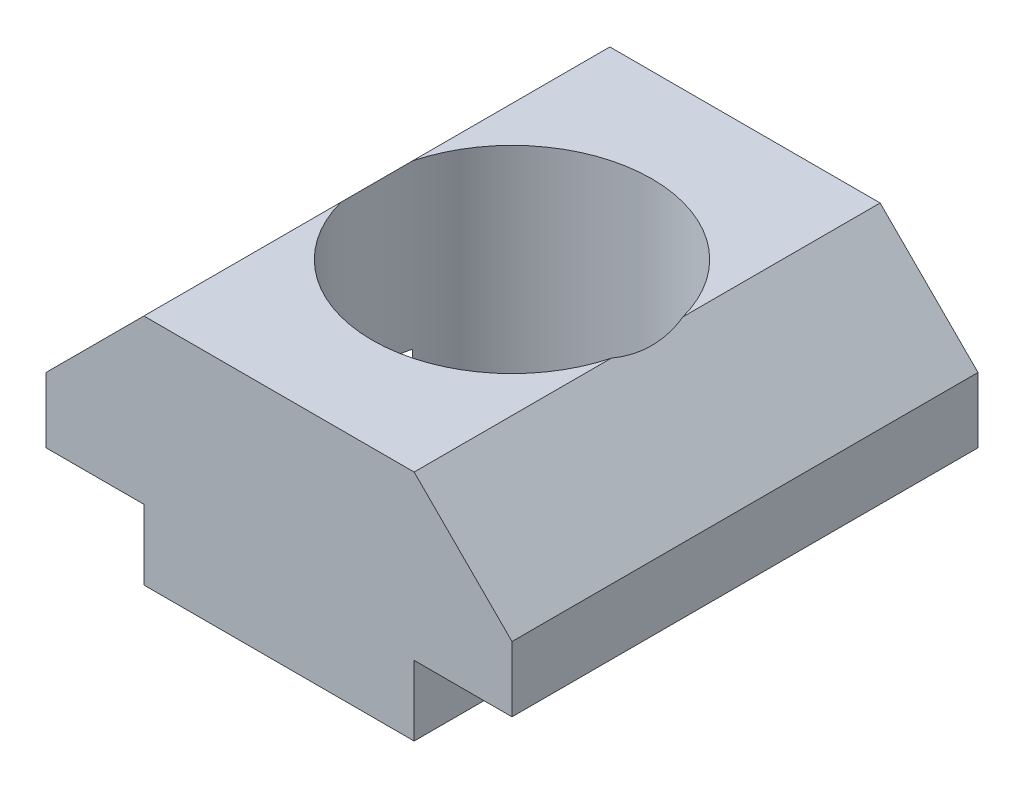
ISO-10303-21;
HEADER;
FILE_DESCRIPTION(('STEP AP214'),'2;1');
FILE_NAME('part.step','',(''),(''),'','','');
FILE_SCHEMA(('AUTOMOTIVE_DESIGN { 1 0 10303 214 1 1 1 1 }'));
ENDSEC;
DATA;
#1=APPLICATION_CONTEXT('core data for automotive mechanical design processes');
#2=APPLICATION_PROTOCOL_DEFINITION('international standard','automotive_design',2000,#1);
#3=PRODUCT_CONTEXT('',#1,'mechanical');
#4=PRODUCT('Part','Part','',(#3));
#5=PRODUCT_RELATED_PRODUCT_CATEGORY('part','',(#4));
#6=PRODUCT_DEFINITION_FORMATION('','',#4);
#7=PRODUCT_DEFINITION_CONTEXT('part definition',#1,'design');
#8=PRODUCT_DEFINITION('design','',#6,#7);
#9=PRODUCT_DEFINITION_SHAPE('','',#8);
#10=(LENGTH_UNIT() NAMED_UNIT(*) SI_UNIT(.MILLI.,.METRE.));
#11=(NAMED_UNIT(*) PLANE_ANGLE_UNIT() SI_UNIT($,.RADIAN.));
#12=(NAMED_UNIT(*) SI_UNIT($,.STERADIAN.) SOLID_ANGLE_UNIT());
#13=UNCERTAINTY_MEASURE_WITH_UNIT(LENGTH_MEASURE(1.E-05),#10,'distance_accuracy_value','');
#14=(GEOMETRIC_REPRESENTATION_CONTEXT(3) GLOBAL_UNCERTAINTY_ASSIGNED_CONTEXT((#13)) GLOBAL_UNIT_ASSIGNED_CONTEXT((#10,
#11,#12)) REPRESENTATION_CONTEXT('',''));
#15=CARTESIAN_POINT('',(0.,0.,0.));
#16=DIRECTION('',(0.,0.,1.));
#17=DIRECTION('',(1.,0.,0.));
#18=AXIS2_PLACEMENT_3D('',#15,#16,#17);
#19=CARTESIAN_POINT('',(-2.9,1.5,-10.));
#20=DIRECTION('',(-1.,0.,0.));
#21=DIRECTION('',(0.,-1.,0.));
#22=AXIS2_PLACEMENT_3D('',#19,#20,#21);
#23=PLANE('',#22);
#24=DIRECTION('',(0.,1.,0.));
#25=VECTOR('',#24,1.);
#26=CARTESIAN_POINT('',(-2.9,0.,-4.2318854252109));
#27=LINE('',#26,#25);
#28=CARTESIAN_POINT('',(-2.9,0.,-4.2318854252109));
#29=VERTEX_POINT('',#28);
#30=CARTESIAN_POINT('',(-2.9,1.5,-4.2318854252109));
#31=VERTEX_POINT('',#30);
#32=EDGE_CURVE('E224',#29,#31,#27,.T.);
#33=ORIENTED_EDGE('',*,*,#32,.F.);
#34=DIRECTION('',(0.,0.,1.));
#35=VECTOR('',#34,1.);
#36=CARTESIAN_POINT('',(-2.9,0.,-10.));
#37=LINE('',#36,#35);
#38=CARTESIAN_POINT('',(-2.9,0.,0.));
#39=VERTEX_POINT('',#38);
#40=EDGE_CURVE('E161',#29,#39,#37,.T.);
#41=ORIENTED_EDGE('',*,*,#40,.T.);
#42=DIRECTION('',(0.,-1.,0.));
#43=VECTOR('',#42,1.);
#44=CARTESIAN_POINT('',(-2.9,1.5,0.));
#45=LINE('',#44,#43);
#46=CARTESIAN_POINT('',(-2.9,1.5,0.));
#47=VERTEX_POINT('',#46);
#48=EDGE_CURVE('E221',#47,#39,#45,.T.);
#49=ORIENTED_EDGE('',*,*,#48,.F.);
#50=DIRECTION('',(0.,0.,1.));
#51=VECTOR('',#50,1.);
#52=CARTESIAN_POINT('',(-2.9,1.5,-10.));
#53=LINE('',#52,#51);
#54=EDGE_CURVE('E192',#31,#47,#53,.T.);
#55=ORIENTED_EDGE('',*,*,#54,.F.);
#56=EDGE_LOOP('',(#33,#41,#49,#55));
#57=FACE_BOUND('',#56,.T.);
#58=ADVANCED_FACE('F34',(#57),#23,.T.);
#59=CARTESIAN_POINT('',(2.9,5.,-10.));
#60=DIRECTION('',(0.,1.,0.));
#61=DIRECTION('',(0.,0.,1.));
#62=AXIS2_PLACEMENT_3D('',#59,#60,#61);
#63=PLANE('',#62);
#64=CARTESIAN_POINT('',(0.,5.,-4.99999999999773));
#65=DIRECTION('',(0.,1.,0.));
#66=DIRECTION('',(0.,0.,1.));
#67=AXIS2_PLACEMENT_3D('',#64,#65,#66);
#68=CIRCLE('',#67,3.);
#69=CARTESIAN_POINT('',(2.9,5.,-5.76811457478462));
#70=VERTEX_POINT('',#69);
#71=CARTESIAN_POINT('',(-2.9,5.,-5.76811457478455));
#72=VERTEX_POINT('',#71);
#73=EDGE_CURVE('E153',#70,#72,#68,.T.);
#74=ORIENTED_EDGE('',*,*,#73,.F.);
#75=DIRECTION('',(0.,0.,1.));
#76=VECTOR('',#75,1.);
#77=CARTESIAN_POINT('',(2.9,5.,-10.));
#78=LINE('',#77,#76);
#79=CARTESIAN_POINT('',(2.9,5.,-10.));
#80=VERTEX_POINT('',#79);
#81=EDGE_CURVE('E181',#80,#70,#78,.T.);
#82=ORIENTED_EDGE('',*,*,#81,.F.);
#83=DIRECTION('',(-1.,0.,0.));
#84=VECTOR('',#83,1.);
#85=CARTESIAN_POINT('',(2.9,5.,-10.));
#86=LINE('',#85,#84);
#87=CARTESIAN_POINT('',(-2.9,5.,-10.));
#88=VERTEX_POINT('',#87);
#89=EDGE_CURVE('E234',#80,#88,#86,.T.);
#90=ORIENTED_EDGE('',*,*,#89,.T.);
#91=DIRECTION('',(0.,0.,1.));
#92=VECTOR('',#91,1.);
#93=CARTESIAN_POINT('',(-2.9,5.,-10.));
#94=LINE('',#93,#92);
#95=EDGE_CURVE('E185',#88,#72,#94,.T.);
#96=ORIENTED_EDGE('',*,*,#95,.T.);
#97=EDGE_LOOP('',(#74,#82,#90,#96));
#98=FACE_BOUND('',#97,.T.);
#99=ADVANCED_FACE('F273',(#98),#63,.T.);
#100=CARTESIAN_POINT('',(2.9,0.,-10.));
#101=DIRECTION('',(1.,0.,0.));
#102=DIRECTION('',(0.,0.,-1.));
#103=AXIS2_PLACEMENT_3D('',#100,#101,#102);
#104=PLANE('',#103);
#105=DIRECTION('',(0.,1.,0.));
#106=VECTOR('',#105,1.);
#107=CARTESIAN_POINT('',(2.9,0.,-5.76811457478462));
#108=LINE('',#107,#106);
#109=CARTESIAN_POINT('',(2.9,0.,-5.76811457478462));
#110=VERTEX_POINT('',#109);
#111=CARTESIAN_POINT('',(2.9,1.5,-5.76811457478462));
#112=VERTEX_POINT('',#111);
#113=EDGE_CURVE('E262',#110,#112,#108,.T.);
#114=ORIENTED_EDGE('',*,*,#113,.F.);
#115=DIRECTION('',(0.,0.,1.));
#116=VECTOR('',#115,1.);
#117=CARTESIAN_POINT('',(2.9,0.,-10.));
#118=LINE('',#117,#116);
#119=CARTESIAN_POINT('',(2.9,0.,-10.));
#120=VERTEX_POINT('',#119);
#121=EDGE_CURVE('E166',#120,#110,#118,.T.);
#122=ORIENTED_EDGE('',*,*,#121,.F.);
#123=DIRECTION('',(0.,1.,0.));
#124=VECTOR('',#123,1.);
#125=CARTESIAN_POINT('',(2.9,0.,-10.));
#126=LINE('',#125,#124);
#127=CARTESIAN_POINT('',(2.9,1.5,-10.));
#128=VERTEX_POINT('',#127);
#129=EDGE_CURVE('E246',#120,#128,#126,.T.);
#130=ORIENTED_EDGE('',*,*,#129,.T.);
#131=DIRECTION('',(0.,0.,1.));
#132=VECTOR('',#131,1.);
#133=CARTESIAN_POINT('',(2.9,1.5,-10.));
#134=LINE('',#133,#132);
#135=EDGE_CURVE('E173',#128,#112,#134,.T.);
#136=ORIENTED_EDGE('',*,*,#135,.T.);
#137=EDGE_LOOP('',(#114,#122,#130,#136));
#138=FACE_BOUND('',#137,.T.);
#139=ADVANCED_FACE('F294',(#138),#104,.T.);
#140=CARTESIAN_POINT('',(-2.9,0.,-10.));
#141=DIRECTION('',(0.,-1.,0.));
#142=DIRECTION('',(0.,0.,-1.));
#143=AXIS2_PLACEMENT_3D('',#140,#141,#142);
#144=PLANE('',#143);
#145=CARTESIAN_POINT('',(0.,0.,-4.99999999999773));
#146=DIRECTION('',(0.,-1.,0.));
#147=DIRECTION('',(0.,0.,-1.));
#148=AXIS2_PLACEMENT_3D('',#145,#146,#147);
#149=CIRCLE('',#148,3.);
#150=CARTESIAN_POINT('',(2.9,0.,-4.23188542521083));
#151=VERTEX_POINT('',#150);
#152=EDGE_CURVE('E11',#151,#29,#149,.T.);
#153=ORIENTED_EDGE('',*,*,#152,.F.);
#154=CARTESIAN_POINT('',(2.9,0.,0.));
#155=VERTEX_POINT('',#154);
#156=EDGE_CURVE('E159',#151,#155,#118,.T.);
#157=ORIENTED_EDGE('',*,*,#156,.T.);
#158=DIRECTION('',(1.,0.,0.));
#159=VECTOR('',#158,1.);
#160=CARTESIAN_POINT('',(-2.9,0.,0.));
#161=LINE('',#160,#159);
#162=EDGE_CURVE('E219',#39,#155,#161,.T.);
#163=ORIENTED_EDGE('',*,*,#162,.F.);
#164=ORIENTED_EDGE('',*,*,#40,.F.);
#165=EDGE_LOOP('',(#153,#157,#163,#164));
#166=FACE_BOUND('',#165,.T.);
#167=ADVANCED_FACE('F157',(#166),#144,.T.);
#168=DIRECTION('',(0.,1.,0.));
#169=VECTOR('',#168,1.);
#170=CARTESIAN_POINT('',(-2.9,0.,-5.76811457478455));
#171=LINE('',#170,#169);
#172=CARTESIAN_POINT('',(-2.9,1.5,-5.76811457478456));
#173=VERTEX_POINT('',#172);
#174=CARTESIAN_POINT('',(-2.9,0.,-5.76811457478455));
#175=VERTEX_POINT('',#174);
#176=EDGE_CURVE('E57',#173,#175,#171,.F.);
#177=ORIENTED_EDGE('',*,*,#176,.F.);
#178=CARTESIAN_POINT('',(-2.9,1.5,-10.));
#179=VERTEX_POINT('',#178);
#180=EDGE_CURVE('E193',#179,#173,#53,.T.);
#181=ORIENTED_EDGE('',*,*,#180,.F.);
#182=DIRECTION('',(0.,-1.,0.));
#183=VECTOR('',#182,1.);
#184=CARTESIAN_POINT('',(-2.9,1.5,-10.));
#185=LINE('',#184,#183);
#186=CARTESIAN_POINT('',(-2.9,0.,-10.));
#187=VERTEX_POINT('',#186);
#188=EDGE_CURVE('E199',#179,#187,#185,.T.);
#189=ORIENTED_EDGE('',*,*,#188,.T.);
#190=EDGE_CURVE('E167',#187,#175,#37,.T.);
#191=ORIENTED_EDGE('',*,*,#190,.T.);
#192=EDGE_LOOP('',(#177,#181,#189,#191));
#193=FACE_BOUND('',#192,.T.);
#194=ADVANCED_FACE('F36',(#193),#23,.T.);
#195=CARTESIAN_POINT('',(-5.,1.5,-10.));
#196=DIRECTION('',(0.,-1.,0.));
#197=DIRECTION('',(0.,0.,-1.));
#198=AXIS2_PLACEMENT_3D('',#195,#196,#197);
#199=PLANE('',#198);
#200=CARTESIAN_POINT('',(0.,1.5,-4.99999999999773));
#201=DIRECTION('',(0.,-1.,0.));
#202=DIRECTION('',(0.,0.,-1.));
#203=AXIS2_PLACEMENT_3D('',#200,#201,#202);
#204=CIRCLE('',#203,3.);
#205=EDGE_CURVE('E256',#31,#173,#204,.T.);
#206=ORIENTED_EDGE('',*,*,#205,.F.);
#207=ORIENTED_EDGE('',*,*,#54,.T.);
#208=DIRECTION('',(1.,0.,0.));
#209=VECTOR('',#208,1.);
#210=CARTESIAN_POINT('',(-5.,1.5,0.));
#211=LINE('',#210,#209);
#212=CARTESIAN_POINT('',(-5.,1.5,0.));
#213=VERTEX_POINT('',#212);
#214=EDGE_CURVE('E196',#213,#47,#211,.T.);
#215=ORIENTED_EDGE('',*,*,#214,.F.);
#216=DIRECTION('',(0.,0.,1.));
#217=VECTOR('',#216,1.);
#218=CARTESIAN_POINT('',(-5.,1.5,-10.));
#219=LINE('',#218,#217);
#220=CARTESIAN_POINT('',(-5.,1.5,-10.));
#221=VERTEX_POINT('',#220);
#222=EDGE_CURVE('E190',#221,#213,#219,.T.);
#223=ORIENTED_EDGE('',*,*,#222,.F.);
#224=DIRECTION('',(1.,0.,0.));
#225=VECTOR('',#224,1.);
#226=CARTESIAN_POINT('',(-5.,1.5,-10.));
#227=LINE('',#226,#225);
#228=EDGE_CURVE('E225',#221,#179,#227,.T.);
#229=ORIENTED_EDGE('',*,*,#228,.T.);
#230=ORIENTED_EDGE('',*,*,#180,.T.);
#231=EDGE_LOOP('',(#206,#207,#215,#223,#229,#230));
#232=FACE_BOUND('',#231,.T.);
#233=ADVANCED_FACE('F302',(#232),#199,.T.);
#234=CARTESIAN_POINT('',(-5.,2.89999999999999,-10.));
#235=DIRECTION('',(-1.,0.,0.));
#236=DIRECTION('',(0.,-1.,0.));
#237=AXIS2_PLACEMENT_3D('',#234,#235,#236);
#238=PLANE('',#237);
#239=DIRECTION('',(0.,-1.,0.));
#240=VECTOR('',#239,1.);
#241=CARTESIAN_POINT('',(-5.,2.89999999999999,0.));
#242=LINE('',#241,#240);
#243=CARTESIAN_POINT('',(-5.,2.89999999999999,0.));
#244=VERTEX_POINT('',#243);
#245=EDGE_CURVE('E200',#244,#213,#242,.T.);
#246=ORIENTED_EDGE('',*,*,#245,.F.);
#247=DIRECTION('',(0.,0.,1.));
#248=VECTOR('',#247,1.);
#249=CARTESIAN_POINT('',(-5.,2.89999999999999,-10.));
#250=LINE('',#249,#248);
#251=CARTESIAN_POINT('',(-5.,2.89999999999999,-10.));
#252=VERTEX_POINT('',#251);
#253=EDGE_CURVE('E188',#252,#244,#250,.T.);
#254=ORIENTED_EDGE('',*,*,#253,.F.);
#255=DIRECTION('',(0.,-1.,0.));
#256=VECTOR('',#255,1.);
#257=CARTESIAN_POINT('',(-5.,2.89999999999999,-10.));
#258=LINE('',#257,#256);
#259=EDGE_CURVE('E228',#252,#221,#258,.T.);
#260=ORIENTED_EDGE('',*,*,#259,.T.);
#261=ORIENTED_EDGE('',*,*,#222,.T.);
#262=EDGE_LOOP('',(#246,#254,#260,#261));
#263=FACE_BOUND('',#262,.T.);
#264=ADVANCED_FACE('F306',(#263),#238,.T.);
#265=CARTESIAN_POINT('',(-2.9,5.,-10.));
#266=DIRECTION('',(-0.707106781186549,0.707106781186546,0.));
#267=DIRECTION('',(-0.707106781186546,-0.707106781186549,0.));
#268=AXIS2_PLACEMENT_3D('',#265,#266,#267);
#269=PLANE('',#268);
#270=CARTESIAN_POINT('',(0.,7.90000000000002,-4.99999999999773));
#271=DIRECTION('',(-0.707106781186549,0.707106781186546,0.));
#272=DIRECTION('',(0.707106781186546,0.707106781186549,0.));
#273=AXIS2_PLACEMENT_3D('',#270,#271,#272);
#274=ELLIPSE('',#273,4.2426406871193,3.);
#275=CARTESIAN_POINT('',(-2.9,5.,-4.2318854252109));
#276=VERTEX_POINT('',#275);
#277=EDGE_CURVE('E258',#72,#276,#274,.T.);
#278=ORIENTED_EDGE('',*,*,#277,.F.);
#279=ORIENTED_EDGE('',*,*,#95,.F.);
#280=DIRECTION('',(-0.707106781186546,-0.707106781186549,0.));
#281=VECTOR('',#280,1.);
#282=CARTESIAN_POINT('',(-2.9,5.,-10.));
#283=LINE('',#282,#281);
#284=EDGE_CURVE('E231',#88,#252,#283,.T.);
#285=ORIENTED_EDGE('',*,*,#284,.T.);
#286=ORIENTED_EDGE('',*,*,#253,.T.);
#287=DIRECTION('',(-0.707106781186546,-0.707106781186549,0.));
#288=VECTOR('',#287,1.);
#289=CARTESIAN_POINT('',(-2.9,5.,0.));
#290=LINE('',#289,#288);
#291=CARTESIAN_POINT('',(-2.9,5.,0.));
#292=VERTEX_POINT('',#291);
#293=EDGE_CURVE('E203',#292,#244,#290,.T.);
#294=ORIENTED_EDGE('',*,*,#293,.F.);
#295=EDGE_CURVE('E184',#276,#292,#94,.T.);
#296=ORIENTED_EDGE('',*,*,#295,.F.);
#297=EDGE_LOOP('',(#278,#279,#285,#286,#294,#296));
#298=FACE_BOUND('',#297,.T.);
#299=ADVANCED_FACE('F270',(#298),#269,.T.);
#300=CARTESIAN_POINT('',(2.9,5.,-4.23188542521084));
#301=VERTEX_POINT('',#300);
#302=EDGE_CURVE('E49',#276,#301,#68,.T.);
#303=ORIENTED_EDGE('',*,*,#302,.F.);
#304=ORIENTED_EDGE('',*,*,#295,.T.);
#305=DIRECTION('',(-1.,0.,0.));
#306=VECTOR('',#305,1.);
#307=CARTESIAN_POINT('',(2.9,5.,0.));
#308=LINE('',#307,#306);
#309=CARTESIAN_POINT('',(2.9,5.,0.));
#310=VERTEX_POINT('',#309);
#311=EDGE_CURVE('E206',#310,#292,#308,.T.);
#312=ORIENTED_EDGE('',*,*,#311,.F.);
#313=EDGE_CURVE('E180',#301,#310,#78,.T.);
#314=ORIENTED_EDGE('',*,*,#313,.F.);
#315=EDGE_LOOP('',(#303,#304,#312,#314));
#316=FACE_BOUND('',#315,.T.);
#317=ADVANCED_FACE('F312',(#316),#63,.T.);
#318=CARTESIAN_POINT('',(5.,2.89999999999999,-10.));
#319=DIRECTION('',(0.707106781186549,0.707106781186546,0.));
#320=DIRECTION('',(-0.707106781186546,0.707106781186549,0.));
#321=AXIS2_PLACEMENT_3D('',#318,#319,#320);
#322=PLANE('',#321);
#323=CARTESIAN_POINT('',(0.,7.90000000000001,-4.99999999999773));
#324=DIRECTION('',(0.707106781186549,0.707106781186546,0.));
#325=DIRECTION('',(-0.707106781186546,0.707106781186549,0.));
#326=AXIS2_PLACEMENT_3D('',#323,#324,#325);
#327=ELLIPSE('',#326,4.2426406871193,3.);
#328=EDGE_CURVE('E260',#301,#70,#327,.T.);
#329=ORIENTED_EDGE('',*,*,#328,.F.);
#330=ORIENTED_EDGE('',*,*,#313,.T.);
#331=DIRECTION('',(-0.707106781186546,0.707106781186549,0.));
#332=VECTOR('',#331,1.);
#333=CARTESIAN_POINT('',(5.,2.89999999999999,0.));
#334=LINE('',#333,#332);
#335=CARTESIAN_POINT('',(5.,2.89999999999999,0.));
#336=VERTEX_POINT('',#335);
#337=EDGE_CURVE('E209',#336,#310,#334,.T.);
#338=ORIENTED_EDGE('',*,*,#337,.F.);
#339=DIRECTION('',(0.,0.,1.));
#340=VECTOR('',#339,1.);
#341=CARTESIAN_POINT('',(5.,2.89999999999999,-10.));
#342=LINE('',#341,#340);
#343=CARTESIAN_POINT('',(5.,2.89999999999999,-10.));
#344=VERTEX_POINT('',#343);
#345=EDGE_CURVE('E178',#344,#336,#342,.T.);
#346=ORIENTED_EDGE('',*,*,#345,.F.);
#347=DIRECTION('',(-0.707106781186546,0.707106781186549,0.));
#348=VECTOR('',#347,1.);
#349=CARTESIAN_POINT('',(5.,2.89999999999999,-10.));
#350=LINE('',#349,#348);
#351=EDGE_CURVE('E237',#344,#80,#350,.T.);
#352=ORIENTED_EDGE('',*,*,#351,.T.);
#353=ORIENTED_EDGE('',*,*,#81,.T.);
#354=EDGE_LOOP('',(#329,#330,#338,#346,#352,#353));
#355=FACE_BOUND('',#354,.T.);
#356=ADVANCED_FACE('F282',(#355),#322,.T.);
#357=CARTESIAN_POINT('',(5.,1.5,-10.));
#358=DIRECTION('',(1.,0.,0.));
#359=DIRECTION('',(0.,0.,-1.));
#360=AXIS2_PLACEMENT_3D('',#357,#358,#359);
#361=PLANE('',#360);
#362=DIRECTION('',(0.,1.,0.));
#363=VECTOR('',#362,1.);
#364=CARTESIAN_POINT('',(5.,1.5,0.));
#365=LINE('',#364,#363);
#366=CARTESIAN_POINT('',(5.,1.5,0.));
#367=VERTEX_POINT('',#366);
#368=EDGE_CURVE('E212',#367,#336,#365,.T.);
#369=ORIENTED_EDGE('',*,*,#368,.F.);
#370=DIRECTION('',(0.,0.,1.));
#371=VECTOR('',#370,1.);
#372=CARTESIAN_POINT('',(5.,1.5,-10.));
#373=LINE('',#372,#371);
#374=CARTESIAN_POINT('',(5.,1.5,-10.));
#375=VERTEX_POINT('',#374);
#376=EDGE_CURVE('E176',#375,#367,#373,.T.);
#377=ORIENTED_EDGE('',*,*,#376,.F.);
#378=DIRECTION('',(0.,1.,0.));
#379=VECTOR('',#378,1.);
#380=CARTESIAN_POINT('',(5.,1.5,-10.));
#381=LINE('',#380,#379);
#382=EDGE_CURVE('E240',#375,#344,#381,.T.);
#383=ORIENTED_EDGE('',*,*,#382,.T.);
#384=ORIENTED_EDGE('',*,*,#345,.T.);
#385=EDGE_LOOP('',(#369,#377,#383,#384));
#386=FACE_BOUND('',#385,.T.);
#387=ADVANCED_FACE('F286',(#386),#361,.T.);
#388=CARTESIAN_POINT('',(2.9,1.5,-10.));
#389=DIRECTION('',(0.,-1.,0.));
#390=DIRECTION('',(1.,0.,0.));
#391=AXIS2_PLACEMENT_3D('',#388,#389,#390);
#392=PLANE('',#391);
#393=CARTESIAN_POINT('',(0.,1.5,-4.99999999999773));
#394=DIRECTION('',(0.,-1.,0.));
#395=DIRECTION('',(1.,0.,0.));
#396=AXIS2_PLACEMENT_3D('',#393,#394,#395);
#397=CIRCLE('',#396,3.);
#398=CARTESIAN_POINT('',(2.9,1.5,-4.23188542521083));
#399=VERTEX_POINT('',#398);
#400=EDGE_CURVE('E149',#112,#399,#397,.T.);
#401=ORIENTED_EDGE('',*,*,#400,.F.);
#402=ORIENTED_EDGE('',*,*,#135,.F.);
#403=DIRECTION('',(1.,0.,0.));
#404=VECTOR('',#403,1.);
#405=CARTESIAN_POINT('',(2.9,1.5,-10.));
#406=LINE('',#405,#404);
#407=EDGE_CURVE('E243',#128,#375,#406,.T.);
#408=ORIENTED_EDGE('',*,*,#407,.T.);
#409=ORIENTED_EDGE('',*,*,#376,.T.);
#410=DIRECTION('',(1.,0.,0.));
#411=VECTOR('',#410,1.);
#412=CARTESIAN_POINT('',(2.9,1.5,0.));
#413=LINE('',#412,#411);
#414=CARTESIAN_POINT('',(2.9,1.5,0.));
#415=VERTEX_POINT('',#414);
#416=EDGE_CURVE('E215',#415,#367,#413,.T.);
#417=ORIENTED_EDGE('',*,*,#416,.F.);
#418=EDGE_CURVE('E170',#399,#415,#134,.T.);
#419=ORIENTED_EDGE('',*,*,#418,.F.);
#420=EDGE_LOOP('',(#401,#402,#408,#409,#417,#419));
#421=FACE_BOUND('',#420,.T.);
#422=ADVANCED_FACE('F290',(#421),#392,.T.);
#423=DIRECTION('',(0.,1.,0.));
#424=VECTOR('',#423,1.);
#425=CARTESIAN_POINT('',(2.9,0.,-4.23188542521083));
#426=LINE('',#425,#424);
#427=EDGE_CURVE('E144',#399,#151,#426,.F.);
#428=ORIENTED_EDGE('',*,*,#427,.F.);
#429=ORIENTED_EDGE('',*,*,#418,.T.);
#430=DIRECTION('',(0.,1.,0.));
#431=VECTOR('',#430,1.);
#432=CARTESIAN_POINT('',(2.9,0.,0.));
#433=LINE('',#432,#431);
#434=EDGE_CURVE('E164',#155,#415,#433,.T.);
#435=ORIENTED_EDGE('',*,*,#434,.F.);
#436=ORIENTED_EDGE('',*,*,#156,.F.);
#437=EDGE_LOOP('',(#428,#429,#435,#436));
#438=FACE_BOUND('',#437,.T.);
#439=ADVANCED_FACE('F162',(#438),#104,.T.);
#440=EDGE_CURVE('E38',#175,#110,#149,.T.);
#441=ORIENTED_EDGE('',*,*,#440,.F.);
#442=ORIENTED_EDGE('',*,*,#190,.F.);
#443=DIRECTION('',(1.,0.,0.));
#444=VECTOR('',#443,1.);
#445=CARTESIAN_POINT('',(-2.9,0.,-10.));
#446=LINE('',#445,#444);
#447=EDGE_CURVE('E249',#187,#120,#446,.T.);
#448=ORIENTED_EDGE('',*,*,#447,.T.);
#449=ORIENTED_EDGE('',*,*,#121,.T.);
#450=EDGE_LOOP('',(#441,#442,#448,#449));
#451=FACE_BOUND('',#450,.T.);
#452=ADVANCED_FACE('F297',(#451),#144,.T.);
#453=CARTESIAN_POINT('',(0.,0.,-10.));
#454=DIRECTION('',(0.,0.,1.));
#455=DIRECTION('',(1.,0.,0.));
#456=AXIS2_PLACEMENT_3D('',#453,#454,#455);
#457=PLANE('',#456);
#458=ORIENTED_EDGE('',*,*,#188,.F.);
#459=ORIENTED_EDGE('',*,*,#228,.F.);
#460=ORIENTED_EDGE('',*,*,#259,.F.);
#461=ORIENTED_EDGE('',*,*,#284,.F.);
#462=ORIENTED_EDGE('',*,*,#89,.F.);
#463=ORIENTED_EDGE('',*,*,#351,.F.);
#464=ORIENTED_EDGE('',*,*,#382,.F.);
#465=ORIENTED_EDGE('',*,*,#407,.F.);
#466=ORIENTED_EDGE('',*,*,#129,.F.);
#467=ORIENTED_EDGE('',*,*,#447,.F.);
#468=EDGE_LOOP('',(#458,#459,#460,#461,#462,#463,#464,#465,#466,#467));
#469=FACE_BOUND('',#468,.T.);
#470=ADVANCED_FACE('F278',(#469),#457,.F.);
#471=CARTESIAN_POINT('',(0.,0.,0.));
#472=DIRECTION('',(0.,0.,1.));
#473=DIRECTION('',(1.,0.,0.));
#474=AXIS2_PLACEMENT_3D('',#471,#472,#473);
#475=PLANE('',#474);
#476=ORIENTED_EDGE('',*,*,#48,.T.);
#477=ORIENTED_EDGE('',*,*,#162,.T.);
#478=ORIENTED_EDGE('',*,*,#434,.T.);
#479=ORIENTED_EDGE('',*,*,#416,.T.);
#480=ORIENTED_EDGE('',*,*,#368,.T.);
#481=ORIENTED_EDGE('',*,*,#337,.T.);
#482=ORIENTED_EDGE('',*,*,#311,.T.);
#483=ORIENTED_EDGE('',*,*,#293,.T.);
#484=ORIENTED_EDGE('',*,*,#245,.T.);
#485=ORIENTED_EDGE('',*,*,#214,.T.);
#486=EDGE_LOOP('',(#476,#477,#478,#479,#480,#481,#482,#483,#484,#485));
#487=FACE_BOUND('',#486,.T.);
#488=ADVANCED_FACE('F308',(#487),#475,.T.);
#489=CARTESIAN_POINT('',(0.,0.,-4.99999999999773));
#490=DIRECTION('',(0.,1.,0.));
#491=DIRECTION('',(0.,0.,1.));
#492=AXIS2_PLACEMENT_3D('',#489,#490,#491);
#493=CYLINDRICAL_SURFACE('',#492,3.);
#494=ORIENTED_EDGE('',*,*,#32,.T.);
#495=ORIENTED_EDGE('',*,*,#205,.T.);
#496=ORIENTED_EDGE('',*,*,#176,.T.);
#497=ORIENTED_EDGE('',*,*,#440,.T.);
#498=ORIENTED_EDGE('',*,*,#113,.T.);
#499=ORIENTED_EDGE('',*,*,#400,.T.);
#500=ORIENTED_EDGE('',*,*,#427,.T.);
#501=ORIENTED_EDGE('',*,*,#152,.T.);
#502=EDGE_LOOP('',(#494,#495,#496,#497,#498,#499,#500,#501));
#503=FACE_BOUND('',#502,.T.);
#504=ORIENTED_EDGE('',*,*,#277,.T.);
#505=ORIENTED_EDGE('',*,*,#302,.T.);
#506=ORIENTED_EDGE('',*,*,#328,.T.);
#507=ORIENTED_EDGE('',*,*,#73,.T.);
#508=EDGE_LOOP('',(#504,#505,#506,#507));
#509=FACE_BOUND('',#508,.T.);
#510=ADVANCED_FACE('F146',(#503,#509),#493,.F.);
#511=CLOSED_SHELL('',(#58,#99,#139,#167,#194,#233,#264,#299,#317,#356,#387,#422,#439,#452,#470,
#488,#510));
#512=MANIFOLD_SOLID_BREP('B2',#511);
#513=ADVANCED_BREP_SHAPE_REPRESENTATION('',(#18,#512),#14);
#514=SHAPE_DEFINITION_REPRESENTATION(#9,#513);
ENDSEC;
END-ISO-10303-21;
